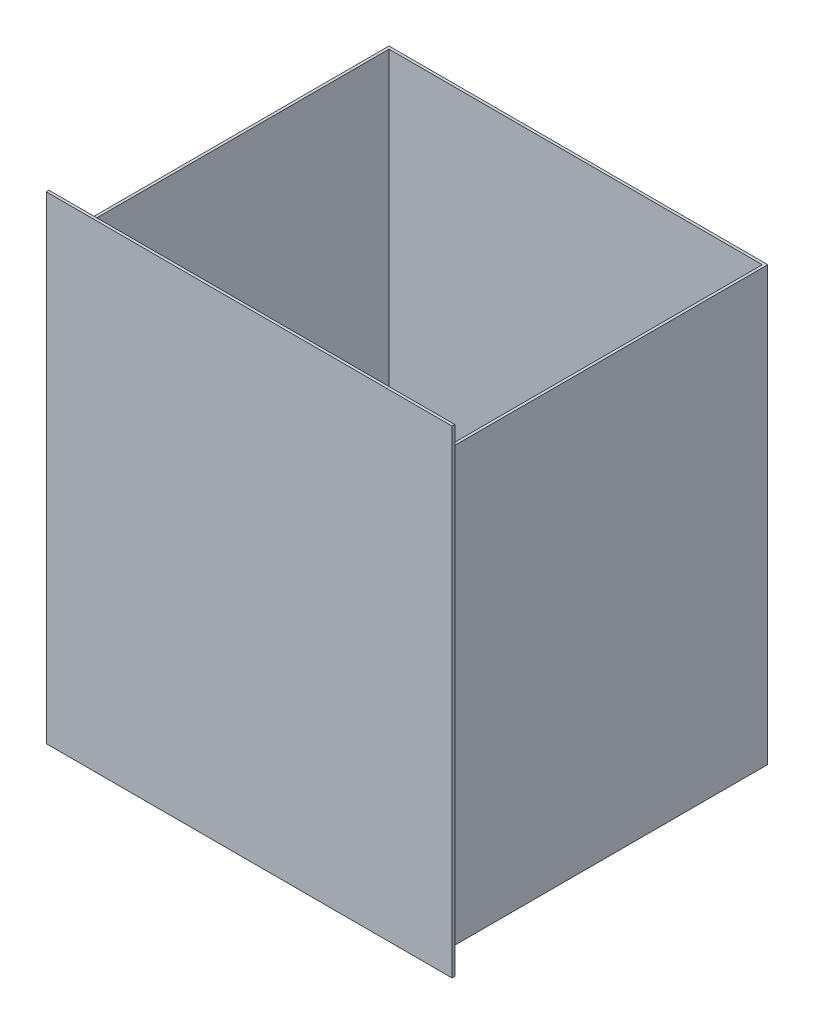
ISO-10303-21;
HEADER;
FILE_DESCRIPTION(('STEP AP214'),'2;1');
FILE_NAME('part.step','',(''),(''),'','','');
FILE_SCHEMA(('AUTOMOTIVE_DESIGN { 1 0 10303 214 1 1 1 1 }'));
ENDSEC;
DATA;
#1=APPLICATION_CONTEXT('core data for automotive mechanical design processes');
#2=APPLICATION_PROTOCOL_DEFINITION('international standard','automotive_design',2000,#1);
#3=PRODUCT_CONTEXT('',#1,'mechanical');
#4=PRODUCT('Part','Part','',(#3));
#5=PRODUCT_RELATED_PRODUCT_CATEGORY('part','',(#4));
#6=PRODUCT_DEFINITION_FORMATION('','',#4);
#7=PRODUCT_DEFINITION_CONTEXT('part definition',#1,'design');
#8=PRODUCT_DEFINITION('design','',#6,#7);
#9=PRODUCT_DEFINITION_SHAPE('','',#8);
#10=(LENGTH_UNIT() NAMED_UNIT(*) SI_UNIT(.MILLI.,.METRE.));
#11=(NAMED_UNIT(*) PLANE_ANGLE_UNIT() SI_UNIT($,.RADIAN.));
#12=(NAMED_UNIT(*) SI_UNIT($,.STERADIAN.) SOLID_ANGLE_UNIT());
#13=UNCERTAINTY_MEASURE_WITH_UNIT(LENGTH_MEASURE(1.E-05),#10,'distance_accuracy_value','');
#14=(GEOMETRIC_REPRESENTATION_CONTEXT(3) GLOBAL_UNCERTAINTY_ASSIGNED_CONTEXT((#13)) GLOBAL_UNIT_ASSIGNED_CONTEXT((#10,
#11,#12)) REPRESENTATION_CONTEXT('',''));
#15=CARTESIAN_POINT('',(0.,0.,0.));
#16=DIRECTION('',(0.,0.,1.));
#17=DIRECTION('',(1.,0.,0.));
#18=AXIS2_PLACEMENT_3D('',#15,#16,#17);
#19=CARTESIAN_POINT('',(210.,3.,180.));
#20=DIRECTION('',(-1.,0.,0.));
#21=DIRECTION('',(0.,0.,1.));
#22=AXIS2_PLACEMENT_3D('',#19,#20,#21);
#23=PLANE('',#22);
#24=DIRECTION('',(0.,0.,-1.));
#25=VECTOR('',#24,1.);
#26=CARTESIAN_POINT('',(210.,480.,180.));
#27=LINE('',#26,#25);
#28=CARTESIAN_POINT('',(210.,480.,177.));
#29=VERTEX_POINT('',#28);
#30=CARTESIAN_POINT('',(210.,480.,-180.));
#31=VERTEX_POINT('',#30);
#32=EDGE_CURVE('E228',#29,#31,#27,.T.);
#33=ORIENTED_EDGE('',*,*,#32,.F.);
#34=DIRECTION('',(0.,-1.,0.));
#35=VECTOR('',#34,1.);
#36=CARTESIAN_POINT('',(210.,3.,177.));
#37=LINE('',#36,#35);
#38=CARTESIAN_POINT('',(210.,0.,177.));
#39=VERTEX_POINT('',#38);
#40=EDGE_CURVE('E81',#29,#39,#37,.T.);
#41=ORIENTED_EDGE('',*,*,#40,.T.);
#42=DIRECTION('',(0.,0.,-1.));
#43=VECTOR('',#42,1.);
#44=CARTESIAN_POINT('',(210.,0.,180.));
#45=LINE('',#44,#43);
#46=CARTESIAN_POINT('',(210.,0.,-180.));
#47=VERTEX_POINT('',#46);
#48=EDGE_CURVE('E235',#39,#47,#45,.T.);
#49=ORIENTED_EDGE('',*,*,#48,.T.);
#50=DIRECTION('',(0.,-1.,0.));
#51=VECTOR('',#50,1.);
#52=CARTESIAN_POINT('',(210.,3.,-180.));
#53=LINE('',#52,#51);
#54=EDGE_CURVE('E12',#31,#47,#53,.T.);
#55=ORIENTED_EDGE('',*,*,#54,.F.);
#56=EDGE_LOOP('',(#33,#41,#49,#55));
#57=FACE_BOUND('',#56,.T.);
#58=ADVANCED_FACE('F59',(#57),#23,.F.);
#59=CARTESIAN_POINT('',(-210.,3.,-180.));
#60=DIRECTION('',(0.,0.,1.));
#61=DIRECTION('',(1.,0.,0.));
#62=AXIS2_PLACEMENT_3D('',#59,#60,#61);
#63=PLANE('',#62);
#64=DIRECTION('',(-1.,0.,0.));
#65=VECTOR('',#64,1.);
#66=CARTESIAN_POINT('',(-210.,0.,-180.));
#67=LINE('',#66,#65);
#68=CARTESIAN_POINT('',(-210.,0.,-180.));
#69=VERTEX_POINT('',#68);
#70=EDGE_CURVE('E237',#47,#69,#67,.T.);
#71=ORIENTED_EDGE('',*,*,#70,.T.);
#72=DIRECTION('',(0.,-1.,0.));
#73=VECTOR('',#72,1.);
#74=CARTESIAN_POINT('',(-210.,3.,-180.));
#75=LINE('',#74,#73);
#76=CARTESIAN_POINT('',(-210.,480.,-180.));
#77=VERTEX_POINT('',#76);
#78=EDGE_CURVE('E66',#77,#69,#75,.T.);
#79=ORIENTED_EDGE('',*,*,#78,.F.);
#80=DIRECTION('',(-1.,0.,0.));
#81=VECTOR('',#80,1.);
#82=CARTESIAN_POINT('',(-210.,480.,-180.));
#83=LINE('',#82,#81);
#84=EDGE_CURVE('E230',#31,#77,#83,.T.);
#85=ORIENTED_EDGE('',*,*,#84,.F.);
#86=ORIENTED_EDGE('',*,*,#54,.T.);
#87=EDGE_LOOP('',(#71,#79,#85,#86));
#88=FACE_BOUND('',#87,.T.);
#89=ADVANCED_FACE('F250',(#88),#63,.F.);
#90=CARTESIAN_POINT('',(-210.,3.,180.));
#91=DIRECTION('',(1.,0.,0.));
#92=DIRECTION('',(0.,0.,-1.));
#93=AXIS2_PLACEMENT_3D('',#90,#91,#92);
#94=PLANE('',#93);
#95=DIRECTION('',(0.,0.,1.));
#96=VECTOR('',#95,1.);
#97=CARTESIAN_POINT('',(-210.,0.,180.));
#98=LINE('',#97,#96);
#99=CARTESIAN_POINT('',(-210.,0.,177.));
#100=VERTEX_POINT('',#99);
#101=EDGE_CURVE('E239',#69,#100,#98,.T.);
#102=ORIENTED_EDGE('',*,*,#101,.T.);
#103=DIRECTION('',(0.,1.,0.));
#104=VECTOR('',#103,1.);
#105=CARTESIAN_POINT('',(-210.,3.,177.));
#106=LINE('',#105,#104);
#107=CARTESIAN_POINT('',(-210.,480.,177.));
#108=VERTEX_POINT('',#107);
#109=EDGE_CURVE('E194',#100,#108,#106,.T.);
#110=ORIENTED_EDGE('',*,*,#109,.T.);
#111=DIRECTION('',(0.,0.,1.));
#112=VECTOR('',#111,1.);
#113=CARTESIAN_POINT('',(-210.,480.,180.));
#114=LINE('',#113,#112);
#115=EDGE_CURVE('E233',#77,#108,#114,.T.);
#116=ORIENTED_EDGE('',*,*,#115,.F.);
#117=ORIENTED_EDGE('',*,*,#78,.T.);
#118=EDGE_LOOP('',(#102,#110,#116,#117));
#119=FACE_BOUND('',#118,.T.);
#120=ADVANCED_FACE('F243',(#119),#94,.F.);
#121=CARTESIAN_POINT('',(0.,0.,0.));
#122=DIRECTION('',(0.,-1.,0.));
#123=DIRECTION('',(0.,0.,-1.));
#124=AXIS2_PLACEMENT_3D('',#121,#122,#123);
#125=PLANE('',#124);
#126=DIRECTION('',(1.,0.,0.));
#127=VECTOR('',#126,1.);
#128=CARTESIAN_POINT('',(0.,0.,177.));
#129=LINE('',#128,#127);
#130=EDGE_CURVE('E73',#100,#39,#129,.T.);
#131=ORIENTED_EDGE('',*,*,#130,.F.);
#132=ORIENTED_EDGE('',*,*,#101,.F.);
#133=ORIENTED_EDGE('',*,*,#70,.F.);
#134=ORIENTED_EDGE('',*,*,#48,.F.);
#135=EDGE_LOOP('',(#131,#132,#133,#134));
#136=FACE_BOUND('',#135,.T.);
#137=ADVANCED_FACE('F248',(#136),#125,.T.);
#138=CARTESIAN_POINT('',(0.,480.,0.));
#139=DIRECTION('',(0.,1.,0.));
#140=DIRECTION('',(0.,0.,1.));
#141=AXIS2_PLACEMENT_3D('',#138,#139,#140);
#142=PLANE('',#141);
#143=DIRECTION('',(-1.,0.,0.));
#144=VECTOR('',#143,1.);
#145=CARTESIAN_POINT('',(0.,480.,177.));
#146=LINE('',#145,#144);
#147=CARTESIAN_POINT('',(207.,480.,177.));
#148=VERTEX_POINT('',#147);
#149=EDGE_CURVE('E195',#29,#148,#146,.T.);
#150=ORIENTED_EDGE('',*,*,#149,.F.);
#151=ORIENTED_EDGE('',*,*,#32,.T.);
#152=ORIENTED_EDGE('',*,*,#84,.T.);
#153=ORIENTED_EDGE('',*,*,#115,.T.);
#154=CARTESIAN_POINT('',(-207.,480.,177.));
#155=VERTEX_POINT('',#154);
#156=EDGE_CURVE('E188',#155,#108,#146,.T.);
#157=ORIENTED_EDGE('',*,*,#156,.F.);
#158=DIRECTION('',(0.,0.,1.));
#159=VECTOR('',#158,1.);
#160=CARTESIAN_POINT('',(-207.,480.,0.));
#161=LINE('',#160,#159);
#162=CARTESIAN_POINT('',(-207.,480.,-177.));
#163=VERTEX_POINT('',#162);
#164=EDGE_CURVE('E205',#163,#155,#161,.T.);
#165=ORIENTED_EDGE('',*,*,#164,.F.);
#166=DIRECTION('',(-1.,0.,0.));
#167=VECTOR('',#166,1.);
#168=CARTESIAN_POINT('',(0.,480.,-177.));
#169=LINE('',#168,#167);
#170=CARTESIAN_POINT('',(207.,480.,-177.));
#171=VERTEX_POINT('',#170);
#172=EDGE_CURVE('E202',#171,#163,#169,.T.);
#173=ORIENTED_EDGE('',*,*,#172,.F.);
#174=DIRECTION('',(0.,0.,-1.));
#175=VECTOR('',#174,1.);
#176=CARTESIAN_POINT('',(207.,480.,0.));
#177=LINE('',#176,#175);
#178=EDGE_CURVE('E200',#148,#171,#177,.T.);
#179=ORIENTED_EDGE('',*,*,#178,.F.);
#180=EDGE_LOOP('',(#150,#151,#152,#153,#157,#165,#173,#179));
#181=FACE_BOUND('',#180,.T.);
#182=ADVANCED_FACE('F257',(#181),#142,.T.);
#183=CARTESIAN_POINT('',(207.,480.,0.));
#184=DIRECTION('',(-1.,0.,0.));
#185=DIRECTION('',(0.,0.,1.));
#186=AXIS2_PLACEMENT_3D('',#183,#184,#185);
#187=PLANE('',#186);
#188=DIRECTION('',(0.,0.,-1.));
#189=VECTOR('',#188,1.);
#190=CARTESIAN_POINT('',(207.,3.,0.));
#191=LINE('',#190,#189);
#192=CARTESIAN_POINT('',(207.,3.,177.));
#193=VERTEX_POINT('',#192);
#194=CARTESIAN_POINT('',(207.,3.,-177.));
#195=VERTEX_POINT('',#194);
#196=EDGE_CURVE('E209',#193,#195,#191,.T.);
#197=ORIENTED_EDGE('',*,*,#196,.F.);
#198=DIRECTION('',(0.,-1.,0.));
#199=VECTOR('',#198,1.);
#200=CARTESIAN_POINT('',(207.,480.,177.));
#201=LINE('',#200,#199);
#202=EDGE_CURVE('E208',#148,#193,#201,.T.);
#203=ORIENTED_EDGE('',*,*,#202,.F.);
#204=ORIENTED_EDGE('',*,*,#178,.T.);
#205=DIRECTION('',(0.,-1.,0.));
#206=VECTOR('',#205,1.);
#207=CARTESIAN_POINT('',(207.,480.,-177.));
#208=LINE('',#207,#206);
#209=EDGE_CURVE('E225',#171,#195,#208,.T.);
#210=ORIENTED_EDGE('',*,*,#209,.T.);
#211=EDGE_LOOP('',(#197,#203,#204,#210));
#212=FACE_BOUND('',#211,.T.);
#213=ADVANCED_FACE('F269',(#212),#187,.T.);
#214=CARTESIAN_POINT('',(0.,480.,-177.));
#215=DIRECTION('',(0.,0.,1.));
#216=DIRECTION('',(1.,0.,0.));
#217=AXIS2_PLACEMENT_3D('',#214,#215,#216);
#218=PLANE('',#217);
#219=DIRECTION('',(-1.,0.,0.));
#220=VECTOR('',#219,1.);
#221=CARTESIAN_POINT('',(0.,3.,-177.));
#222=LINE('',#221,#220);
#223=CARTESIAN_POINT('',(-207.,3.,-177.));
#224=VERTEX_POINT('',#223);
#225=EDGE_CURVE('E212',#195,#224,#222,.T.);
#226=ORIENTED_EDGE('',*,*,#225,.F.);
#227=ORIENTED_EDGE('',*,*,#209,.F.);
#228=ORIENTED_EDGE('',*,*,#172,.T.);
#229=DIRECTION('',(0.,-1.,0.));
#230=VECTOR('',#229,1.);
#231=CARTESIAN_POINT('',(-207.,480.,-177.));
#232=LINE('',#231,#230);
#233=EDGE_CURVE('E223',#163,#224,#232,.T.);
#234=ORIENTED_EDGE('',*,*,#233,.T.);
#235=EDGE_LOOP('',(#226,#227,#228,#234));
#236=FACE_BOUND('',#235,.T.);
#237=ADVANCED_FACE('F265',(#236),#218,.T.);
#238=CARTESIAN_POINT('',(-207.,480.,0.));
#239=DIRECTION('',(1.,0.,0.));
#240=DIRECTION('',(0.,0.,-1.));
#241=AXIS2_PLACEMENT_3D('',#238,#239,#240);
#242=PLANE('',#241);
#243=DIRECTION('',(0.,0.,1.));
#244=VECTOR('',#243,1.);
#245=CARTESIAN_POINT('',(-207.,3.,0.));
#246=LINE('',#245,#244);
#247=CARTESIAN_POINT('',(-207.,3.,177.));
#248=VERTEX_POINT('',#247);
#249=EDGE_CURVE('E215',#224,#248,#246,.T.);
#250=ORIENTED_EDGE('',*,*,#249,.F.);
#251=ORIENTED_EDGE('',*,*,#233,.F.);
#252=ORIENTED_EDGE('',*,*,#164,.T.);
#253=DIRECTION('',(0.,-1.,0.));
#254=VECTOR('',#253,1.);
#255=CARTESIAN_POINT('',(-207.,480.,177.));
#256=LINE('',#255,#254);
#257=EDGE_CURVE('E221',#155,#248,#256,.T.);
#258=ORIENTED_EDGE('',*,*,#257,.T.);
#259=EDGE_LOOP('',(#250,#251,#252,#258));
#260=FACE_BOUND('',#259,.T.);
#261=ADVANCED_FACE('F263',(#260),#242,.T.);
#262=CARTESIAN_POINT('',(0.,480.,177.));
#263=DIRECTION('',(0.,0.,-1.));
#264=DIRECTION('',(-1.,0.,0.));
#265=AXIS2_PLACEMENT_3D('',#262,#263,#264);
#266=PLANE('',#265);
#267=DIRECTION('',(1.,0.,0.));
#268=VECTOR('',#267,1.);
#269=CARTESIAN_POINT('',(0.,3.,177.));
#270=LINE('',#269,#268);
#271=EDGE_CURVE('E203',#248,#193,#270,.T.);
#272=ORIENTED_EDGE('',*,*,#271,.F.);
#273=ORIENTED_EDGE('',*,*,#257,.F.);
#274=ORIENTED_EDGE('',*,*,#156,.T.);
#275=ORIENTED_EDGE('',*,*,#109,.F.);
#276=ORIENTED_EDGE('',*,*,#130,.T.);
#277=ORIENTED_EDGE('',*,*,#40,.F.);
#278=ORIENTED_EDGE('',*,*,#149,.T.);
#279=ORIENTED_EDGE('',*,*,#202,.T.);
#280=EDGE_LOOP('',(#272,#273,#274,#275,#276,#277,#278,#279));
#281=FACE_BOUND('',#280,.T.);
#282=DIRECTION('',(0.,-1.,0.));
#283=VECTOR('',#282,1.);
#284=CARTESIAN_POINT('',(-230.,-20.,177.));
#285=LINE('',#284,#283);
#286=CARTESIAN_POINT('',(-230.,510.,177.));
#287=VERTEX_POINT('',#286);
#288=CARTESIAN_POINT('',(-230.,-20.,177.));
#289=VERTEX_POINT('',#288);
#290=EDGE_CURVE('E167',#287,#289,#285,.T.);
#291=ORIENTED_EDGE('',*,*,#290,.F.);
#292=DIRECTION('',(-1.,0.,0.));
#293=VECTOR('',#292,1.);
#294=CARTESIAN_POINT('',(-230.,510.,177.));
#295=LINE('',#294,#293);
#296=CARTESIAN_POINT('',(220.,510.,177.));
#297=VERTEX_POINT('',#296);
#298=EDGE_CURVE('E160',#297,#287,#295,.T.);
#299=ORIENTED_EDGE('',*,*,#298,.F.);
#300=DIRECTION('',(0.,1.,0.));
#301=VECTOR('',#300,1.);
#302=CARTESIAN_POINT('',(220.,-20.,177.));
#303=LINE('',#302,#301);
#304=CARTESIAN_POINT('',(220.,-20.,177.));
#305=VERTEX_POINT('',#304);
#306=EDGE_CURVE('E170',#305,#297,#303,.T.);
#307=ORIENTED_EDGE('',*,*,#306,.F.);
#308=DIRECTION('',(1.,0.,0.));
#309=VECTOR('',#308,1.);
#310=CARTESIAN_POINT('',(-230.,-20.,177.));
#311=LINE('',#310,#309);
#312=EDGE_CURVE('E152',#289,#305,#311,.T.);
#313=ORIENTED_EDGE('',*,*,#312,.F.);
#314=EDGE_LOOP('',(#291,#299,#307,#313));
#315=FACE_BOUND('',#314,.T.);
#316=ADVANCED_FACE('F165',(#281,#315),#266,.T.);
#317=CARTESIAN_POINT('',(0.,3.,0.));
#318=DIRECTION('',(0.,-1.,0.));
#319=DIRECTION('',(0.,0.,-1.));
#320=AXIS2_PLACEMENT_3D('',#317,#318,#319);
#321=PLANE('',#320);
#322=ORIENTED_EDGE('',*,*,#271,.T.);
#323=ORIENTED_EDGE('',*,*,#196,.T.);
#324=ORIENTED_EDGE('',*,*,#225,.T.);
#325=ORIENTED_EDGE('',*,*,#249,.T.);
#326=EDGE_LOOP('',(#322,#323,#324,#325));
#327=FACE_BOUND('',#326,.T.);
#328=ADVANCED_FACE('F271',(#327),#321,.F.);
#329=CARTESIAN_POINT('',(-230.,-20.,177.));
#330=DIRECTION('',(-1.,0.,0.));
#331=DIRECTION('',(0.,0.,1.));
#332=AXIS2_PLACEMENT_3D('',#329,#330,#331);
#333=PLANE('',#332);
#334=DIRECTION('',(0.,-1.,0.));
#335=VECTOR('',#334,1.);
#336=CARTESIAN_POINT('',(-230.,-20.,180.));
#337=LINE('',#336,#335);
#338=CARTESIAN_POINT('',(-230.,510.,180.));
#339=VERTEX_POINT('',#338);
#340=CARTESIAN_POINT('',(-230.,-20.,180.));
#341=VERTEX_POINT('',#340);
#342=EDGE_CURVE('E182',#339,#341,#337,.T.);
#343=ORIENTED_EDGE('',*,*,#342,.F.);
#344=DIRECTION('',(0.,0.,1.));
#345=VECTOR('',#344,1.);
#346=CARTESIAN_POINT('',(-230.,510.,177.));
#347=LINE('',#346,#345);
#348=EDGE_CURVE('E173',#287,#339,#347,.T.);
#349=ORIENTED_EDGE('',*,*,#348,.F.);
#350=ORIENTED_EDGE('',*,*,#290,.T.);
#351=DIRECTION('',(0.,0.,1.));
#352=VECTOR('',#351,1.);
#353=CARTESIAN_POINT('',(-230.,-20.,177.));
#354=LINE('',#353,#352);
#355=EDGE_CURVE('E149',#289,#341,#354,.T.);
#356=ORIENTED_EDGE('',*,*,#355,.T.);
#357=EDGE_LOOP('',(#343,#349,#350,#356));
#358=FACE_BOUND('',#357,.T.);
#359=ADVANCED_FACE('F172',(#358),#333,.T.);
#360=CARTESIAN_POINT('',(-230.,510.,177.));
#361=DIRECTION('',(0.,1.,0.));
#362=DIRECTION('',(0.,0.,1.));
#363=AXIS2_PLACEMENT_3D('',#360,#361,#362);
#364=PLANE('',#363);
#365=DIRECTION('',(-1.,0.,0.));
#366=VECTOR('',#365,1.);
#367=CARTESIAN_POINT('',(-230.,510.,180.));
#368=LINE('',#367,#366);
#369=CARTESIAN_POINT('',(220.,510.,180.));
#370=VERTEX_POINT('',#369);
#371=EDGE_CURVE('E174',#370,#339,#368,.T.);
#372=ORIENTED_EDGE('',*,*,#371,.F.);
#373=DIRECTION('',(0.,0.,1.));
#374=VECTOR('',#373,1.);
#375=CARTESIAN_POINT('',(220.,510.,177.));
#376=LINE('',#375,#374);
#377=EDGE_CURVE('E189',#297,#370,#376,.T.);
#378=ORIENTED_EDGE('',*,*,#377,.F.);
#379=ORIENTED_EDGE('',*,*,#298,.T.);
#380=ORIENTED_EDGE('',*,*,#348,.T.);
#381=EDGE_LOOP('',(#372,#378,#379,#380));
#382=FACE_BOUND('',#381,.T.);
#383=ADVANCED_FACE('F279',(#382),#364,.T.);
#384=CARTESIAN_POINT('',(220.,-20.,177.));
#385=DIRECTION('',(1.,0.,0.));
#386=DIRECTION('',(0.,0.,-1.));
#387=AXIS2_PLACEMENT_3D('',#384,#385,#386);
#388=PLANE('',#387);
#389=DIRECTION('',(0.,1.,0.));
#390=VECTOR('',#389,1.);
#391=CARTESIAN_POINT('',(220.,-20.,180.));
#392=LINE('',#391,#390);
#393=CARTESIAN_POINT('',(220.,-20.,180.));
#394=VERTEX_POINT('',#393);
#395=EDGE_CURVE('E177',#394,#370,#392,.T.);
#396=ORIENTED_EDGE('',*,*,#395,.F.);
#397=DIRECTION('',(0.,0.,1.));
#398=VECTOR('',#397,1.);
#399=CARTESIAN_POINT('',(220.,-20.,177.));
#400=LINE('',#399,#398);
#401=EDGE_CURVE('E159',#305,#394,#400,.T.);
#402=ORIENTED_EDGE('',*,*,#401,.F.);
#403=ORIENTED_EDGE('',*,*,#306,.T.);
#404=ORIENTED_EDGE('',*,*,#377,.T.);
#405=EDGE_LOOP('',(#396,#402,#403,#404));
#406=FACE_BOUND('',#405,.T.);
#407=ADVANCED_FACE('F312',(#406),#388,.T.);
#408=CARTESIAN_POINT('',(-230.,-20.,177.));
#409=DIRECTION('',(0.,-1.,0.));
#410=DIRECTION('',(0.,0.,-1.));
#411=AXIS2_PLACEMENT_3D('',#408,#409,#410);
#412=PLANE('',#411);
#413=DIRECTION('',(1.,0.,0.));
#414=VECTOR('',#413,1.);
#415=CARTESIAN_POINT('',(-230.,-20.,180.));
#416=LINE('',#415,#414);
#417=EDGE_CURVE('E154',#341,#394,#416,.T.);
#418=ORIENTED_EDGE('',*,*,#417,.F.);
#419=ORIENTED_EDGE('',*,*,#355,.F.);
#420=ORIENTED_EDGE('',*,*,#312,.T.);
#421=ORIENTED_EDGE('',*,*,#401,.T.);
#422=EDGE_LOOP('',(#418,#419,#420,#421));
#423=FACE_BOUND('',#422,.T.);
#424=ADVANCED_FACE('F151',(#423),#412,.T.);
#425=CARTESIAN_POINT('',(-210.,3.,180.));
#426=DIRECTION('',(0.,0.,-1.));
#427=DIRECTION('',(-1.,0.,0.));
#428=AXIS2_PLACEMENT_3D('',#425,#426,#427);
#429=PLANE('',#428);
#430=ORIENTED_EDGE('',*,*,#342,.T.);
#431=ORIENTED_EDGE('',*,*,#417,.T.);
#432=ORIENTED_EDGE('',*,*,#395,.T.);
#433=ORIENTED_EDGE('',*,*,#371,.T.);
#434=EDGE_LOOP('',(#430,#431,#432,#433));
#435=FACE_BOUND('',#434,.T.);
#436=ADVANCED_FACE('F294',(#435),#429,.F.);
#437=CLOSED_SHELL('',(#58,#89,#120,#137,#182,#213,#237,#261,#316,#328,#359,#383,#407,#424,#436));
#438=MANIFOLD_SOLID_BREP('B2',#437);
#439=ADVANCED_BREP_SHAPE_REPRESENTATION('',(#18,#438),#14);
#440=SHAPE_DEFINITION_REPRESENTATION(#9,#439);
ENDSEC;
END-ISO-10303-21;
